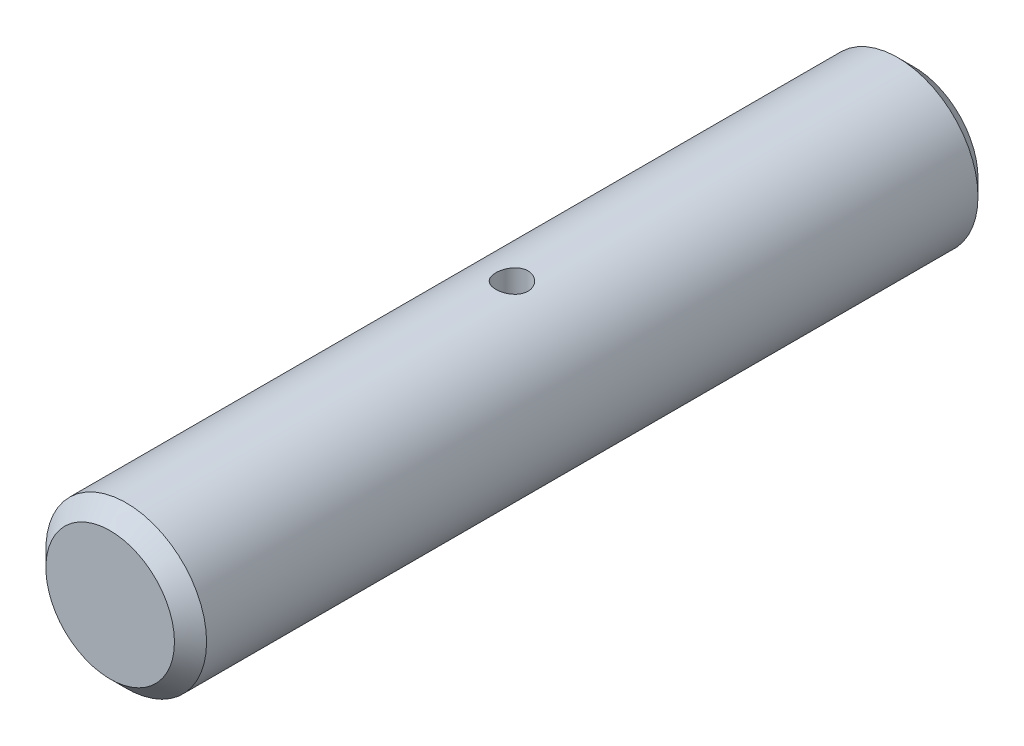
ISO-10303-21;
HEADER;
FILE_DESCRIPTION(('STEP AP214'),'2;1');
FILE_NAME('part.step','',(''),(''),'','','');
FILE_SCHEMA(('AUTOMOTIVE_DESIGN { 1 0 10303 214 1 1 1 1 }'));
ENDSEC;
DATA;
#1=APPLICATION_CONTEXT('core data for automotive mechanical design processes');
#2=APPLICATION_PROTOCOL_DEFINITION('international standard','automotive_design',2000,#1);
#3=PRODUCT_CONTEXT('',#1,'mechanical');
#4=PRODUCT('Part','Part','',(#3));
#5=PRODUCT_RELATED_PRODUCT_CATEGORY('part','',(#4));
#6=PRODUCT_DEFINITION_FORMATION('','',#4);
#7=PRODUCT_DEFINITION_CONTEXT('part definition',#1,'design');
#8=PRODUCT_DEFINITION('design','',#6,#7);
#9=PRODUCT_DEFINITION_SHAPE('','',#8);
#10=(LENGTH_UNIT() NAMED_UNIT(*) SI_UNIT(.MILLI.,.METRE.));
#11=(NAMED_UNIT(*) PLANE_ANGLE_UNIT() SI_UNIT($,.RADIAN.));
#12=(NAMED_UNIT(*) SI_UNIT($,.STERADIAN.) SOLID_ANGLE_UNIT());
#13=UNCERTAINTY_MEASURE_WITH_UNIT(LENGTH_MEASURE(1.E-05),#10,'distance_accuracy_value','');
#14=(GEOMETRIC_REPRESENTATION_CONTEXT(3) GLOBAL_UNCERTAINTY_ASSIGNED_CONTEXT((#13)) GLOBAL_UNIT_ASSIGNED_CONTEXT((#10,
#11,#12)) REPRESENTATION_CONTEXT('',''));
#15=CARTESIAN_POINT('',(0.,0.,0.));
#16=DIRECTION('',(0.,0.,1.));
#17=DIRECTION('',(1.,0.,0.));
#18=AXIS2_PLACEMENT_3D('',#15,#16,#17);
#19=CARTESIAN_POINT('',(0.,0.,25.));
#20=DIRECTION('',(0.,0.,-1.));
#21=DIRECTION('',(-1.,0.,0.));
#22=AXIS2_PLACEMENT_3D('',#19,#20,#21);
#23=CYLINDRICAL_SURFACE('',#22,5.);
#24=CARTESIAN_POINT('',(0.,-5.,1.));
#25=CARTESIAN_POINT('',(0.0555769067926332,-4.99999897580871,0.999997955501655));
#26=CARTESIAN_POINT('',(0.111179660201522,-4.99906385178231,0.995351157032355));
#27=CARTESIAN_POINT('',(0.220813507689019,-4.99542365623231,0.976901499884755));
#28=CARTESIAN_POINT('',(0.274843317541356,-4.99271717860186,0.96309136719849));
#29=CARTESIAN_POINT('',(0.379730305263313,-4.98583649278287,0.926758726379211));
#30=CARTESIAN_POINT('',(0.430590467933134,-4.98166369076718,0.904244563155312));
#31=CARTESIAN_POINT('',(0.527807988864225,-4.97230398035314,0.851167752488706));
#32=CARTESIAN_POINT('',(0.574165615075812,-4.96711713235707,0.820605584392795));
#33=CARTESIAN_POINT('',(0.661693477314865,-4.9562216532997,0.751861505708566));
#34=CARTESIAN_POINT('',(0.702793951158524,-4.95050745504347,0.713591644608798));
#35=CARTESIAN_POINT('',(0.778036756608028,-4.93924180452588,0.630707583608298));
#36=CARTESIAN_POINT('',(0.812178544770424,-4.93369036500424,0.586092888664882));
#37=CARTESIAN_POINT('',(0.87283175334762,-4.92332441812615,0.491283806988125));
#38=CARTESIAN_POINT('',(0.899270938865866,-4.91851707364946,0.441042356203641));
#39=CARTESIAN_POINT('',(0.943305666580308,-4.91026268058418,0.336718180995921));
#40=CARTESIAN_POINT('',(0.960902082437238,-4.90681549761962,0.282635836653655));
#41=CARTESIAN_POINT('',(0.986525299884827,-4.90172805252204,0.172915636092083));
#42=CARTESIAN_POINT('',(0.994674497958777,-4.90006470107188,0.117307455857774));
#43=CARTESIAN_POINT('',(1.00155212772612,-4.89866375060627,0.00549017863565777));
#44=CARTESIAN_POINT('',(1.0002815227135,-4.89892595467841,-0.0507188563201451));
#45=CARTESIAN_POINT('',(0.988454573101819,-4.90132551148185,-0.161246788021003));
#46=CARTESIAN_POINT('',(0.978038540243905,-4.90343452858763,-0.215581405627314));
#47=CARTESIAN_POINT('',(0.94843788462305,-4.90924546160001,-0.321716076663002));
#48=CARTESIAN_POINT('',(0.929252843100681,-4.91294745357779,-0.373516008919008));
#49=CARTESIAN_POINT('',(0.88252478367472,-4.92155618500408,-0.473515261703599));
#50=CARTESIAN_POINT('',(0.854926151232114,-4.92647089813704,-0.521687879569172));
#51=CARTESIAN_POINT('',(0.792193574572679,-4.93694618773062,-0.612770849972814));
#52=CARTESIAN_POINT('',(0.757058764356829,-4.94250683838366,-0.655680596851157));
#53=CARTESIAN_POINT('',(0.679499934560584,-4.95377021241462,-0.735829402456936));
#54=CARTESIAN_POINT('',(0.636956161212445,-4.95947369210905,-0.77295256785913));
#55=CARTESIAN_POINT('',(0.54618502406201,-4.97028848714408,-0.839553846301224));
#56=CARTESIAN_POINT('',(0.497957587379389,-4.97539979488974,-0.869031861293579));
#57=CARTESIAN_POINT('',(0.397059386878921,-4.98446690160887,-0.919527509225975));
#58=CARTESIAN_POINT('',(0.3443818195853,-4.98842088848272,-0.940531893644537));
#59=CARTESIAN_POINT('',(0.236148976448665,-4.99471408987858,-0.973360474038567));
#60=CARTESIAN_POINT('',(0.18059405007245,-4.99705350000531,-0.985185782073628));
#61=CARTESIAN_POINT('',(0.0691794056271506,-4.99982671866868,-0.999156453794277));
#62=CARTESIAN_POINT('',(0.0133403283255764,-5.0002917465247,-1.00146041954027));
#63=CARTESIAN_POINT('',(-0.0979249341927138,-4.99935051930103,-0.996750141057819));
#64=CARTESIAN_POINT('',(-0.153351142443793,-4.99794436941446,-0.989736420647404));
#65=CARTESIAN_POINT('',(-0.261705659946541,-4.99343832008018,-0.966721626456044));
#66=CARTESIAN_POINT('',(-0.314651948339903,-4.99035376404206,-0.950801931502097));
#67=CARTESIAN_POINT('',(-0.417123627499667,-4.98283552061033,-0.910516017344191));
#68=CARTESIAN_POINT('',(-0.466648761637539,-4.97840173214227,-0.88614916532317));
#69=CARTESIAN_POINT('',(-0.561541173686217,-4.96859911533294,-0.829317509348687));
#70=CARTESIAN_POINT('',(-0.606850126752188,-4.96321950437052,-0.796757218961055));
#71=CARTESIAN_POINT('',(-0.691418019119206,-4.95214734829882,-0.724590808792719));
#72=CARTESIAN_POINT('',(-0.730676308930762,-4.94645476968388,-0.684983933600133));
#73=CARTESIAN_POINT('',(-0.802640590774176,-4.93529303556965,-0.599126648108876));
#74=CARTESIAN_POINT('',(-0.835237702448655,-4.92982860233304,-0.552784255778663));
#75=CARTESIAN_POINT('',(-0.892185420051205,-4.91984191796194,-0.455188638643321));
#76=CARTESIAN_POINT('',(-0.916536355922902,-4.91531962913342,-0.403935610426448));
#77=CARTESIAN_POINT('',(-0.95615184158196,-4.90776740584383,-0.298231753850452));
#78=CARTESIAN_POINT('',(-0.971463499791051,-4.90472974872186,-0.243799158789681));
#79=CARTESIAN_POINT('',(-0.992708651627196,-4.90047436792025,-0.133066546509095));
#80=CARTESIAN_POINT('',(-0.998643368225112,-4.89925640691111,-0.0767667737906529));
#81=CARTESIAN_POINT('',(-1.00092091086747,-4.89879149631379,0.0350088645443183));
#82=CARTESIAN_POINT('',(-0.997435788070896,-4.89950919189301,0.0904811489270091));
#83=CARTESIAN_POINT('',(-0.981352304100061,-4.90275573484614,0.200031649905026));
#84=CARTESIAN_POINT('',(-0.968754016129298,-4.90528456767169,0.254109877694805));
#85=CARTESIAN_POINT('',(-0.934878568498954,-4.91185264219158,0.359227711240545));
#86=CARTESIAN_POINT('',(-0.913622506717345,-4.9158882101883,0.410274360502415));
#87=CARTESIAN_POINT('',(-0.863054644601604,-4.9250171497417,0.508103720734441));
#88=CARTESIAN_POINT('',(-0.833742168774882,-4.93011060998894,0.554886073725137));
#89=CARTESIAN_POINT('',(-0.767305914786414,-4.94088960523225,0.643715572150314));
#90=CARTESIAN_POINT('',(-0.73005788723518,-4.94658372909699,0.685668765267595));
#91=CARTESIAN_POINT('',(-0.649064369013141,-4.95786081871954,0.762786205529171));
#92=CARTESIAN_POINT('',(-0.605317387153335,-4.96344375863184,0.797948890317272));
#93=CARTESIAN_POINT('',(-0.512017629088247,-4.97393832387971,0.860834643946447));
#94=CARTESIAN_POINT('',(-0.462408884429835,-4.97884231219246,0.888476003280025));
#95=CARTESIAN_POINT('',(-0.359166360940733,-4.98735125085,0.934986122596591));
#96=CARTESIAN_POINT('',(-0.305536260863126,-4.99095737138616,0.953862789532492));
#97=CARTESIAN_POINT('',(-0.209821488923779,-4.9957637259537,0.978651948044716));
#98=CARTESIAN_POINT('',(-0.168281664013784,-4.99734303158452,0.986643193707757));
#99=CARTESIAN_POINT('',(-0.0844995252100667,-4.99946154139893,0.997317912358364));
#100=CARTESIAN_POINT('',(-0.0422572337486189,-5.00000077873155,1.00000155450977));
#101=CARTESIAN_POINT('',(0.,-5.,1.));
#102=B_SPLINE_CURVE_WITH_KNOTS('',3,(#24,#25,#26,#27,#28,#29,#30,#31,#32,#33,#34,#35,#36,#37,
#38,#39,#40,#41,#42,#43,#44,#45,#46,#47,#48,#49,#50,#51,#52,#53,#54,#55,#56,#57,#58,#59,#60,#61,
#62,#63,#64,#65,#66,#67,#68,#69,#70,#71,#72,#73,#74,#75,#76,#77,#78,#79,#80,#81,#82,#83,#84,#85,
#86,#87,#88,#89,#90,#91,#92,#93,#94,#95,#96,#97,#98,#99,#100,#101),.UNSPECIFIED.,.T.,.F.,(4,2,2,
2,2,2,2,2,2,2,2,2,2,2,2,2,2,2,2,2,2,2,2,2,2,2,2,2,2,2,2,2,2,2,2,2,2,2,4),(0.,0.166576130661258,
0.333284650691323,0.499833735250341,0.666372902230863,0.834932670112186,1.00350559674737,
1.17361195005923,1.34370149365197,1.51156185103587,1.67940504281225,1.84471727006278,
2.0100373925373,2.17647490203593,2.3429315474967,2.51238252491351,2.6818356753982,
2.85155274854024,3.02124925698036,3.18810735676265,3.35495607657868,3.52030453950723,
3.68566539216022,3.85305066033359,4.0204538834593,4.19040628579226,4.36035188723466,
4.52940381032723,4.69843368330415,4.86439722567701,5.03035943492608,5.1959196125311,
5.36149367581866,5.52988076239143,5.6983065453293,5.86849496675637,6.03852955517518,
6.16518775289894,6.29184191370996),.UNSPECIFIED.);
#103=CARTESIAN_POINT('',(0.,-5.,1.));
#104=VERTEX_POINT('',#103);
#105=EDGE_CURVE('E10',#104,#104,#102,.T.);
#106=ORIENTED_EDGE('',*,*,#105,.T.);
#107=EDGE_LOOP('',(#106));
#108=FACE_BOUND('',#107,.T.);
#109=CARTESIAN_POINT('',(0.,5.,1.));
#110=CARTESIAN_POINT('',(-0.0555769067926332,4.99999897580871,0.999997955501655));
#111=CARTESIAN_POINT('',(-0.111179660201522,4.99906385178231,0.995351157032355));
#112=CARTESIAN_POINT('',(-0.220813507689019,4.99542365623231,0.976901499884755));
#113=CARTESIAN_POINT('',(-0.274843317541356,4.99271717860186,0.96309136719849));
#114=CARTESIAN_POINT('',(-0.379730305263313,4.98583649278287,0.926758726379211));
#115=CARTESIAN_POINT('',(-0.430590467933134,4.98166369076718,0.904244563155312));
#116=CARTESIAN_POINT('',(-0.527807988864225,4.97230398035314,0.851167752488706));
#117=CARTESIAN_POINT('',(-0.574165615075812,4.96711713235707,0.820605584392795));
#118=CARTESIAN_POINT('',(-0.661693477314865,4.9562216532997,0.751861505708566));
#119=CARTESIAN_POINT('',(-0.702793951158524,4.95050745504347,0.713591644608798));
#120=CARTESIAN_POINT('',(-0.778036756608028,4.93924180452588,0.630707583608298));
#121=CARTESIAN_POINT('',(-0.812178544770424,4.93369036500424,0.586092888664882));
#122=CARTESIAN_POINT('',(-0.87283175334762,4.92332441812615,0.491283806988125));
#123=CARTESIAN_POINT('',(-0.899270938865866,4.91851707364946,0.441042356203641));
#124=CARTESIAN_POINT('',(-0.943305666580308,4.91026268058418,0.336718180995921));
#125=CARTESIAN_POINT('',(-0.960902082437238,4.90681549761962,0.282635836653655));
#126=CARTESIAN_POINT('',(-0.986525299884827,4.90172805252204,0.172915636092083));
#127=CARTESIAN_POINT('',(-0.994674497958777,4.90006470107188,0.117307455857774));
#128=CARTESIAN_POINT('',(-1.00155212772612,4.89866375060627,0.00549017863565777));
#129=CARTESIAN_POINT('',(-1.0002815227135,4.89892595467841,-0.0507188563201451));
#130=CARTESIAN_POINT('',(-0.988454573101819,4.90132551148185,-0.161246788021003));
#131=CARTESIAN_POINT('',(-0.978038540243905,4.90343452858763,-0.215581405627314));
#132=CARTESIAN_POINT('',(-0.94843788462305,4.90924546160001,-0.321716076663002));
#133=CARTESIAN_POINT('',(-0.929252843100681,4.91294745357779,-0.373516008919008));
#134=CARTESIAN_POINT('',(-0.88252478367472,4.92155618500408,-0.473515261703599));
#135=CARTESIAN_POINT('',(-0.854926151232114,4.92647089813704,-0.521687879569172));
#136=CARTESIAN_POINT('',(-0.792193574572679,4.93694618773062,-0.612770849972814));
#137=CARTESIAN_POINT('',(-0.757058764356829,4.94250683838366,-0.655680596851157));
#138=CARTESIAN_POINT('',(-0.679499934560584,4.95377021241462,-0.735829402456936));
#139=CARTESIAN_POINT('',(-0.636956161212445,4.95947369210905,-0.77295256785913));
#140=CARTESIAN_POINT('',(-0.54618502406201,4.97028848714408,-0.839553846301224));
#141=CARTESIAN_POINT('',(-0.497957587379389,4.97539979488974,-0.869031861293579));
#142=CARTESIAN_POINT('',(-0.397059386878921,4.98446690160887,-0.919527509225975));
#143=CARTESIAN_POINT('',(-0.3443818195853,4.98842088848272,-0.940531893644537));
#144=CARTESIAN_POINT('',(-0.236148976448665,4.99471408987858,-0.973360474038567));
#145=CARTESIAN_POINT('',(-0.18059405007245,4.99705350000531,-0.985185782073628));
#146=CARTESIAN_POINT('',(-0.0691794056271506,4.99982671866868,-0.999156453794277));
#147=CARTESIAN_POINT('',(-0.0133403283255764,5.0002917465247,-1.00146041954027));
#148=CARTESIAN_POINT('',(0.0979249341927138,4.99935051930103,-0.996750141057819));
#149=CARTESIAN_POINT('',(0.153351142443793,4.99794436941446,-0.989736420647404));
#150=CARTESIAN_POINT('',(0.261705659946541,4.99343832008018,-0.966721626456044));
#151=CARTESIAN_POINT('',(0.314651948339903,4.99035376404206,-0.950801931502097));
#152=CARTESIAN_POINT('',(0.417123627499667,4.98283552061033,-0.910516017344191));
#153=CARTESIAN_POINT('',(0.466648761637539,4.97840173214227,-0.88614916532317));
#154=CARTESIAN_POINT('',(0.561541173686217,4.96859911533294,-0.829317509348687));
#155=CARTESIAN_POINT('',(0.606850126752188,4.96321950437052,-0.796757218961055));
#156=CARTESIAN_POINT('',(0.691418019119206,4.95214734829882,-0.724590808792719));
#157=CARTESIAN_POINT('',(0.730676308930762,4.94645476968388,-0.684983933600133));
#158=CARTESIAN_POINT('',(0.802640590774176,4.93529303556965,-0.599126648108876));
#159=CARTESIAN_POINT('',(0.835237702448655,4.92982860233304,-0.552784255778663));
#160=CARTESIAN_POINT('',(0.892185420051205,4.91984191796194,-0.455188638643321));
#161=CARTESIAN_POINT('',(0.916536355922902,4.91531962913342,-0.403935610426448));
#162=CARTESIAN_POINT('',(0.95615184158196,4.90776740584383,-0.298231753850452));
#163=CARTESIAN_POINT('',(0.971463499791051,4.90472974872186,-0.243799158789681));
#164=CARTESIAN_POINT('',(0.992708651627196,4.90047436792025,-0.133066546509095));
#165=CARTESIAN_POINT('',(0.998643368225112,4.89925640691111,-0.0767667737906529));
#166=CARTESIAN_POINT('',(1.00092091086747,4.89879149631379,0.0350088645443183));
#167=CARTESIAN_POINT('',(0.997435788070896,4.89950919189301,0.0904811489270091));
#168=CARTESIAN_POINT('',(0.981352304100061,4.90275573484614,0.200031649905026));
#169=CARTESIAN_POINT('',(0.968754016129298,4.90528456767169,0.254109877694805));
#170=CARTESIAN_POINT('',(0.934878568498954,4.91185264219158,0.359227711240545));
#171=CARTESIAN_POINT('',(0.913622506717345,4.9158882101883,0.410274360502415));
#172=CARTESIAN_POINT('',(0.863054644601604,4.9250171497417,0.508103720734441));
#173=CARTESIAN_POINT('',(0.833742168774882,4.93011060998894,0.554886073725137));
#174=CARTESIAN_POINT('',(0.767305914786414,4.94088960523225,0.643715572150314));
#175=CARTESIAN_POINT('',(0.73005788723518,4.94658372909699,0.685668765267595));
#176=CARTESIAN_POINT('',(0.649064369013141,4.95786081871954,0.762786205529171));
#177=CARTESIAN_POINT('',(0.605317387153335,4.96344375863184,0.797948890317272));
#178=CARTESIAN_POINT('',(0.512017629088247,4.97393832387971,0.860834643946447));
#179=CARTESIAN_POINT('',(0.462408884429835,4.97884231219246,0.888476003280025));
#180=CARTESIAN_POINT('',(0.359166360940733,4.98735125085,0.934986122596591));
#181=CARTESIAN_POINT('',(0.305536260863126,4.99095737138616,0.953862789532492));
#182=CARTESIAN_POINT('',(0.209821488923779,4.9957637259537,0.978651948044716));
#183=CARTESIAN_POINT('',(0.168281664013784,4.99734303158452,0.986643193707757));
#184=CARTESIAN_POINT('',(0.0844995252100667,4.99946154139893,0.997317912358364));
#185=CARTESIAN_POINT('',(0.0422572337486189,5.00000077873155,1.00000155450977));
#186=CARTESIAN_POINT('',(0.,5.,1.));
#187=B_SPLINE_CURVE_WITH_KNOTS('',3,(#109,#110,#111,#112,#113,#114,#115,#116,#117,#118,#119,
#120,#121,#122,#123,#124,#125,#126,#127,#128,#129,#130,#131,#132,#133,#134,#135,#136,#137,#138,
#139,#140,#141,#142,#143,#144,#145,#146,#147,#148,#149,#150,#151,#152,#153,#154,#155,#156,#157,
#158,#159,#160,#161,#162,#163,#164,#165,#166,#167,#168,#169,#170,#171,#172,#173,#174,#175,#176,
#177,#178,#179,#180,#181,#182,#183,#184,#185,#186),.UNSPECIFIED.,.T.,.F.,(4,2,2,2,2,2,2,2,2,2,2,
2,2,2,2,2,2,2,2,2,2,2,2,2,2,2,2,2,2,2,2,2,2,2,2,2,2,2,4),(0.,0.166576130661258,
0.333284650691323,0.499833735250341,0.666372902230863,0.834932670112186,1.00350559674737,
1.17361195005923,1.34370149365197,1.51156185103587,1.67940504281225,1.84471727006278,
2.0100373925373,2.17647490203593,2.3429315474967,2.51238252491351,2.6818356753982,
2.85155274854024,3.02124925698036,3.18810735676265,3.35495607657868,3.52030453950723,
3.68566539216022,3.85305066033359,4.0204538834593,4.19040628579226,4.36035188723466,
4.52940381032723,4.69843368330415,4.86439722567701,5.03035943492608,5.1959196125311,
5.36149367581866,5.52988076239143,5.6983065453293,5.86849496675637,6.03852955517518,
6.16518775289894,6.29184191370996),.UNSPECIFIED.);
#188=CARTESIAN_POINT('',(0.,5.,1.));
#189=VERTEX_POINT('',#188);
#190=EDGE_CURVE('E52',#189,#189,#187,.T.);
#191=ORIENTED_EDGE('',*,*,#190,.T.);
#192=EDGE_LOOP('',(#191));
#193=FACE_BOUND('',#192,.T.);
#194=CARTESIAN_POINT('',(0.,0.,-24.));
#195=DIRECTION('',(0.,0.,1.));
#196=DIRECTION('',(1.,0.,0.));
#197=AXIS2_PLACEMENT_3D('',#194,#195,#196);
#198=CIRCLE('',#197,5.);
#199=CARTESIAN_POINT('',(5.,0.,-24.));
#200=VERTEX_POINT('',#199);
#201=EDGE_CURVE('E94',#200,#200,#198,.T.);
#202=ORIENTED_EDGE('',*,*,#201,.T.);
#203=EDGE_LOOP('',(#202));
#204=FACE_BOUND('',#203,.T.);
#205=CARTESIAN_POINT('',(0.,0.,24.));
#206=DIRECTION('',(0.,0.,1.));
#207=DIRECTION('',(1.,0.,0.));
#208=AXIS2_PLACEMENT_3D('',#205,#206,#207);
#209=CIRCLE('',#208,5.);
#210=CARTESIAN_POINT('',(5.,0.,24.));
#211=VERTEX_POINT('',#210);
#212=EDGE_CURVE('E97',#211,#211,#209,.F.);
#213=ORIENTED_EDGE('',*,*,#212,.T.);
#214=EDGE_LOOP('',(#213));
#215=FACE_BOUND('',#214,.T.);
#216=ADVANCED_FACE('F39',(#108,#193,#204,#215),#23,.T.);
#217=CARTESIAN_POINT('',(0.,0.,25.));
#218=DIRECTION('',(0.,0.,1.));
#219=DIRECTION('',(1.,0.,0.));
#220=AXIS2_PLACEMENT_3D('',#217,#218,#219);
#221=PLANE('',#220);
#222=CARTESIAN_POINT('',(0.,0.,25.));
#223=DIRECTION('',(0.,0.,1.));
#224=DIRECTION('',(1.,0.,0.));
#225=AXIS2_PLACEMENT_3D('',#222,#223,#224);
#226=CIRCLE('',#225,4.00000000000001);
#227=CARTESIAN_POINT('',(4.00000000000001,0.,25.));
#228=VERTEX_POINT('',#227);
#229=EDGE_CURVE('E56',#228,#228,#226,.T.);
#230=ORIENTED_EDGE('',*,*,#229,.T.);
#231=EDGE_LOOP('',(#230));
#232=FACE_BOUND('',#231,.T.);
#233=ADVANCED_FACE('F73',(#232),#221,.T.);
#234=CARTESIAN_POINT('',(0.,0.,-25.));
#235=DIRECTION('',(0.,0.,1.));
#236=DIRECTION('',(1.,0.,0.));
#237=AXIS2_PLACEMENT_3D('',#234,#235,#236);
#238=PLANE('',#237);
#239=CARTESIAN_POINT('',(0.,0.,-25.));
#240=DIRECTION('',(0.,0.,1.));
#241=DIRECTION('',(1.,0.,0.));
#242=AXIS2_PLACEMENT_3D('',#239,#240,#241);
#243=CIRCLE('',#242,4.);
#244=CARTESIAN_POINT('',(4.,0.,-25.));
#245=VERTEX_POINT('',#244);
#246=EDGE_CURVE('E60',#245,#245,#243,.F.);
#247=ORIENTED_EDGE('',*,*,#246,.T.);
#248=EDGE_LOOP('',(#247));
#249=FACE_BOUND('',#248,.T.);
#250=ADVANCED_FACE('F76',(#249),#238,.F.);
#251=CARTESIAN_POINT('',(0.,0.,-24.));
#252=DIRECTION('',(0.,0.,1.));
#253=DIRECTION('',(1.,0.,0.));
#254=AXIS2_PLACEMENT_3D('',#251,#252,#253);
#255=CONICAL_SURFACE('',#254,5.,0.785398163397453);
#256=ORIENTED_EDGE('',*,*,#246,.F.);
#257=EDGE_LOOP('',(#256));
#258=FACE_BOUND('',#257,.T.);
#259=ORIENTED_EDGE('',*,*,#201,.F.);
#260=EDGE_LOOP('',(#259));
#261=FACE_BOUND('',#260,.T.);
#262=ADVANCED_FACE('F79',(#258,#261),#255,.T.);
#263=CARTESIAN_POINT('',(0.,0.,25.));
#264=DIRECTION('',(0.,0.,-1.));
#265=DIRECTION('',(-1.,0.,0.));
#266=AXIS2_PLACEMENT_3D('',#263,#264,#265);
#267=CONICAL_SURFACE('',#266,4.00000000000001,0.785398163397446);
#268=ORIENTED_EDGE('',*,*,#212,.F.);
#269=EDGE_LOOP('',(#268));
#270=FACE_BOUND('',#269,.T.);
#271=ORIENTED_EDGE('',*,*,#229,.F.);
#272=EDGE_LOOP('',(#271));
#273=FACE_BOUND('',#272,.T.);
#274=ADVANCED_FACE('F42',(#270,#273),#267,.T.);
#275=CARTESIAN_POINT('',(0.,-5.,0.));
#276=DIRECTION('',(0.,1.,0.));
#277=DIRECTION('',(0.,0.,1.));
#278=AXIS2_PLACEMENT_3D('',#275,#276,#277);
#279=CYLINDRICAL_SURFACE('',#278,1.);
#280=ORIENTED_EDGE('',*,*,#190,.F.);
#281=EDGE_LOOP('',(#280));
#282=FACE_BOUND('',#281,.T.);
#283=ORIENTED_EDGE('',*,*,#105,.F.);
#284=EDGE_LOOP('',(#283));
#285=FACE_BOUND('',#284,.T.);
#286=ADVANCED_FACE('F68',(#282,#285),#279,.F.);
#287=CLOSED_SHELL('',(#216,#233,#250,#262,#274,#286));
#288=MANIFOLD_SOLID_BREP('B2',#287);
#289=ADVANCED_BREP_SHAPE_REPRESENTATION('',(#18,#288),#14);
#290=SHAPE_DEFINITION_REPRESENTATION(#9,#289);
ENDSEC;
END-ISO-10303-21;
